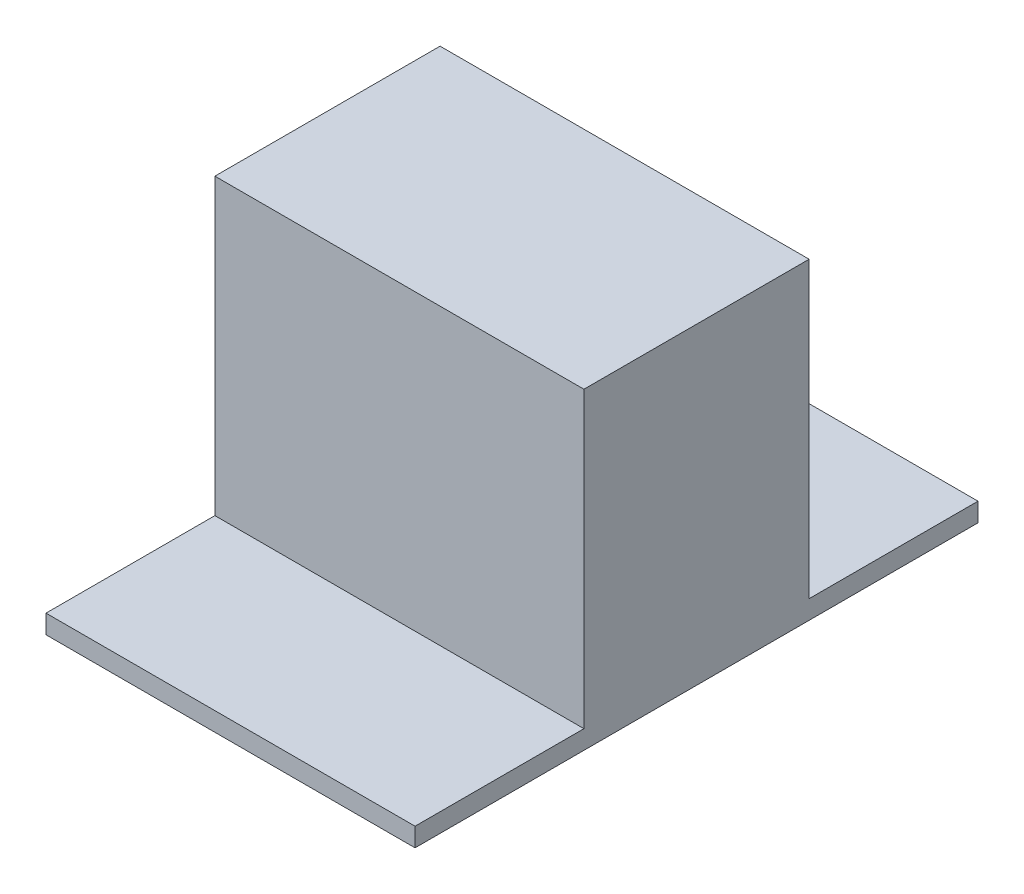
ISO-10303-21;
HEADER;
FILE_DESCRIPTION(('STEP AP214'),'2;1');
FILE_NAME('part.step','',(''),(''),'','','');
FILE_SCHEMA(('AUTOMOTIVE_DESIGN { 1 0 10303 214 1 1 1 1 }'));
ENDSEC;
DATA;
#1=APPLICATION_CONTEXT('core data for automotive mechanical design processes');
#2=APPLICATION_PROTOCOL_DEFINITION('international standard','automotive_design',2000,#1);
#3=PRODUCT_CONTEXT('',#1,'mechanical');
#4=PRODUCT('Part','Part','',(#3));
#5=PRODUCT_RELATED_PRODUCT_CATEGORY('part','',(#4));
#6=PRODUCT_DEFINITION_FORMATION('','',#4);
#7=PRODUCT_DEFINITION_CONTEXT('part definition',#1,'design');
#8=PRODUCT_DEFINITION('design','',#6,#7);
#9=PRODUCT_DEFINITION_SHAPE('','',#8);
#10=(LENGTH_UNIT() NAMED_UNIT(*) SI_UNIT(.MILLI.,.METRE.));
#11=(NAMED_UNIT(*) PLANE_ANGLE_UNIT() SI_UNIT($,.RADIAN.));
#12=(NAMED_UNIT(*) SI_UNIT($,.STERADIAN.) SOLID_ANGLE_UNIT());
#13=UNCERTAINTY_MEASURE_WITH_UNIT(LENGTH_MEASURE(1.E-05),#10,'distance_accuracy_value','');
#14=(GEOMETRIC_REPRESENTATION_CONTEXT(3) GLOBAL_UNCERTAINTY_ASSIGNED_CONTEXT((#13)) GLOBAL_UNIT_ASSIGNED_CONTEXT((#10,
#11,#12)) REPRESENTATION_CONTEXT('',''));
#15=CARTESIAN_POINT('',(0.,0.,0.));
#16=DIRECTION('',(0.,0.,1.));
#17=DIRECTION('',(1.,0.,0.));
#18=AXIS2_PLACEMENT_3D('',#15,#16,#17);
#19=CARTESIAN_POINT('',(0.,0.,0.));
#20=DIRECTION('',(0.,0.,-1.));
#21=DIRECTION('',(-1.,0.,0.));
#22=AXIS2_PLACEMENT_3D('',#19,#20,#21);
#23=PLANE('',#22);
#24=DIRECTION('',(0.,1.,0.));
#25=VECTOR('',#24,1.);
#26=CARTESIAN_POINT('',(590.,0.,0.));
#27=LINE('',#26,#25);
#28=CARTESIAN_POINT('',(590.,30.,0.));
#29=VERTEX_POINT('',#28);
#30=CARTESIAN_POINT('',(590.,500.,0.));
#31=VERTEX_POINT('',#30);
#32=EDGE_CURVE('E232',#29,#31,#27,.T.);
#33=ORIENTED_EDGE('',*,*,#32,.F.);
#34=DIRECTION('',(-1.,0.,0.));
#35=VECTOR('',#34,1.);
#36=CARTESIAN_POINT('',(590.,30.,0.));
#37=LINE('',#36,#35);
#38=CARTESIAN_POINT('',(0.,29.9999999999999,0.));
#39=VERTEX_POINT('',#38);
#40=EDGE_CURVE('E127',#29,#39,#37,.T.);
#41=ORIENTED_EDGE('',*,*,#40,.T.);
#42=DIRECTION('',(0.,-1.,0.));
#43=VECTOR('',#42,1.);
#44=CARTESIAN_POINT('',(0.,0.,0.));
#45=LINE('',#44,#43);
#46=CARTESIAN_POINT('',(0.,500.,0.));
#47=VERTEX_POINT('',#46);
#48=EDGE_CURVE('E221',#47,#39,#45,.T.);
#49=ORIENTED_EDGE('',*,*,#48,.F.);
#50=DIRECTION('',(-1.,0.,0.));
#51=VECTOR('',#50,1.);
#52=CARTESIAN_POINT('',(0.,500.,0.));
#53=LINE('',#52,#51);
#54=EDGE_CURVE('E225',#31,#47,#53,.T.);
#55=ORIENTED_EDGE('',*,*,#54,.F.);
#56=EDGE_LOOP('',(#33,#41,#49,#55));
#57=FACE_BOUND('',#56,.T.);
#58=ADVANCED_FACE('F32',(#57),#23,.T.);
#59=DIRECTION('',(0.,1.,0.));
#60=VECTOR('',#59,1.);
#61=CARTESIAN_POINT('',(30.0000000000001,-10.,0.));
#62=LINE('',#61,#60);
#63=CARTESIAN_POINT('',(30.0000000000001,-10.,0.));
#64=VERTEX_POINT('',#63);
#65=CARTESIAN_POINT('',(30.0000000000001,0.,0.));
#66=VERTEX_POINT('',#65);
#67=EDGE_CURVE('E214',#64,#66,#62,.T.);
#68=ORIENTED_EDGE('',*,*,#67,.T.);
#69=DIRECTION('',(1.,0.,0.));
#70=VECTOR('',#69,1.);
#71=CARTESIAN_POINT('',(590.,0.,0.));
#72=LINE('',#71,#70);
#73=CARTESIAN_POINT('',(560.,0.,0.));
#74=VERTEX_POINT('',#73);
#75=EDGE_CURVE('E11',#66,#74,#72,.T.);
#76=ORIENTED_EDGE('',*,*,#75,.T.);
#77=DIRECTION('',(0.,1.,0.));
#78=VECTOR('',#77,1.);
#79=CARTESIAN_POINT('',(560.,-10.,0.));
#80=LINE('',#79,#78);
#81=CARTESIAN_POINT('',(560.,-10.,0.));
#82=VERTEX_POINT('',#81);
#83=EDGE_CURVE('E208',#82,#74,#80,.T.);
#84=ORIENTED_EDGE('',*,*,#83,.F.);
#85=DIRECTION('',(1.,0.,0.));
#86=VECTOR('',#85,1.);
#87=CARTESIAN_POINT('',(30.0000000000001,-10.,0.));
#88=LINE('',#87,#86);
#89=EDGE_CURVE('E206',#64,#82,#88,.T.);
#90=ORIENTED_EDGE('',*,*,#89,.F.);
#91=EDGE_LOOP('',(#68,#76,#84,#90));
#92=FACE_BOUND('',#91,.T.);
#93=ADVANCED_FACE('F270',(#92),#23,.T.);
#94=CARTESIAN_POINT('',(0.,0.,360.));
#95=DIRECTION('',(0.,0.,-1.));
#96=DIRECTION('',(-1.,0.,0.));
#97=AXIS2_PLACEMENT_3D('',#94,#95,#96);
#98=PLANE('',#97);
#99=DIRECTION('',(1.,0.,0.));
#100=VECTOR('',#99,1.);
#101=CARTESIAN_POINT('',(590.,0.,360.));
#102=LINE('',#101,#100);
#103=CARTESIAN_POINT('',(30.0000000000001,0.,360.));
#104=VERTEX_POINT('',#103);
#105=CARTESIAN_POINT('',(560.,0.,360.));
#106=VERTEX_POINT('',#105);
#107=EDGE_CURVE('E41',#104,#106,#102,.T.);
#108=ORIENTED_EDGE('',*,*,#107,.F.);
#109=DIRECTION('',(0.,1.,0.));
#110=VECTOR('',#109,1.);
#111=CARTESIAN_POINT('',(30.0000000000001,-10.,360.));
#112=LINE('',#111,#110);
#113=CARTESIAN_POINT('',(30.0000000000001,-10.,360.));
#114=VERTEX_POINT('',#113);
#115=EDGE_CURVE('E217',#114,#104,#112,.T.);
#116=ORIENTED_EDGE('',*,*,#115,.F.);
#117=DIRECTION('',(-1.,0.,0.));
#118=VECTOR('',#117,1.);
#119=CARTESIAN_POINT('',(30.0000000000001,-10.,360.));
#120=LINE('',#119,#118);
#121=CARTESIAN_POINT('',(560.,-10.,360.));
#122=VERTEX_POINT('',#121);
#123=EDGE_CURVE('E201',#122,#114,#120,.T.);
#124=ORIENTED_EDGE('',*,*,#123,.F.);
#125=DIRECTION('',(0.,1.,0.));
#126=VECTOR('',#125,1.);
#127=CARTESIAN_POINT('',(560.,-10.,360.));
#128=LINE('',#127,#126);
#129=EDGE_CURVE('E57',#122,#106,#128,.T.);
#130=ORIENTED_EDGE('',*,*,#129,.T.);
#131=EDGE_LOOP('',(#108,#116,#124,#130));
#132=FACE_BOUND('',#131,.T.);
#133=ADVANCED_FACE('F275',(#132),#98,.F.);
#134=DIRECTION('',(-1.,0.,0.));
#135=VECTOR('',#134,1.);
#136=CARTESIAN_POINT('',(590.,30.,360.));
#137=LINE('',#136,#135);
#138=CARTESIAN_POINT('',(590.,30.,360.));
#139=VERTEX_POINT('',#138);
#140=CARTESIAN_POINT('',(0.,29.9999999999999,360.));
#141=VERTEX_POINT('',#140);
#142=EDGE_CURVE('E49',#139,#141,#137,.T.);
#143=ORIENTED_EDGE('',*,*,#142,.F.);
#144=DIRECTION('',(0.,1.,0.));
#145=VECTOR('',#144,1.);
#146=CARTESIAN_POINT('',(590.,0.,360.));
#147=LINE('',#146,#145);
#148=CARTESIAN_POINT('',(590.,500.,360.));
#149=VERTEX_POINT('',#148);
#150=EDGE_CURVE('E224',#139,#149,#147,.T.);
#151=ORIENTED_EDGE('',*,*,#150,.T.);
#152=DIRECTION('',(-1.,0.,0.));
#153=VECTOR('',#152,1.);
#154=CARTESIAN_POINT('',(0.,500.,360.));
#155=LINE('',#154,#153);
#156=CARTESIAN_POINT('',(0.,500.,360.));
#157=VERTEX_POINT('',#156);
#158=EDGE_CURVE('E227',#149,#157,#155,.T.);
#159=ORIENTED_EDGE('',*,*,#158,.T.);
#160=DIRECTION('',(0.,-1.,0.));
#161=VECTOR('',#160,1.);
#162=CARTESIAN_POINT('',(0.,0.,360.));
#163=LINE('',#162,#161);
#164=EDGE_CURVE('E222',#157,#141,#163,.T.);
#165=ORIENTED_EDGE('',*,*,#164,.T.);
#166=EDGE_LOOP('',(#143,#151,#159,#165));
#167=FACE_BOUND('',#166,.T.);
#168=ADVANCED_FACE('F253',(#167),#98,.F.);
#169=CARTESIAN_POINT('',(0.,0.,360.));
#170=DIRECTION('',(0.,1.,0.));
#171=DIRECTION('',(0.,0.,1.));
#172=AXIS2_PLACEMENT_3D('',#169,#170,#171);
#173=PLANE('',#172);
#174=ORIENTED_EDGE('',*,*,#75,.F.);
#175=DIRECTION('',(0.,0.,-1.));
#176=VECTOR('',#175,1.);
#177=CARTESIAN_POINT('',(30.0000000000001,0.,0.));
#178=LINE('',#177,#176);
#179=EDGE_CURVE('E202',#104,#66,#178,.T.);
#180=ORIENTED_EDGE('',*,*,#179,.F.);
#181=ORIENTED_EDGE('',*,*,#107,.T.);
#182=DIRECTION('',(0.,0.,1.));
#183=VECTOR('',#182,1.);
#184=CARTESIAN_POINT('',(560.,0.,0.));
#185=LINE('',#184,#183);
#186=EDGE_CURVE('E195',#74,#106,#185,.T.);
#187=ORIENTED_EDGE('',*,*,#186,.F.);
#188=EDGE_LOOP('',(#174,#180,#181,#187));
#189=FACE_BOUND('',#188,.T.);
#190=DIRECTION('',(0.,0.,-1.));
#191=VECTOR('',#190,1.);
#192=CARTESIAN_POINT('',(0.,0.,360.));
#193=LINE('',#192,#191);
#194=CARTESIAN_POINT('',(0.,0.,630.));
#195=VERTEX_POINT('',#194);
#196=CARTESIAN_POINT('',(0.,0.,-270.));
#197=VERTEX_POINT('',#196);
#198=EDGE_CURVE('E36',#195,#197,#193,.T.);
#199=ORIENTED_EDGE('',*,*,#198,.T.);
#200=DIRECTION('',(1.,0.,0.));
#201=VECTOR('',#200,1.);
#202=CARTESIAN_POINT('',(590.,0.,-270.));
#203=LINE('',#202,#201);
#204=CARTESIAN_POINT('',(590.,0.,-270.));
#205=VERTEX_POINT('',#204);
#206=EDGE_CURVE('E132',#197,#205,#203,.T.);
#207=ORIENTED_EDGE('',*,*,#206,.T.);
#208=DIRECTION('',(0.,0.,-1.));
#209=VECTOR('',#208,1.);
#210=CARTESIAN_POINT('',(590.,0.,360.));
#211=LINE('',#210,#209);
#212=CARTESIAN_POINT('',(590.,0.,630.));
#213=VERTEX_POINT('',#212);
#214=EDGE_CURVE('E146',#213,#205,#211,.T.);
#215=ORIENTED_EDGE('',*,*,#214,.F.);
#216=DIRECTION('',(1.,0.,0.));
#217=VECTOR('',#216,1.);
#218=CARTESIAN_POINT('',(590.,0.,630.));
#219=LINE('',#218,#217);
#220=EDGE_CURVE('E161',#195,#213,#219,.T.);
#221=ORIENTED_EDGE('',*,*,#220,.F.);
#222=EDGE_LOOP('',(#199,#207,#215,#221));
#223=FACE_BOUND('',#222,.T.);
#224=ADVANCED_FACE('F241',(#189,#223),#173,.F.);
#225=CARTESIAN_POINT('',(0.,0.,360.));
#226=DIRECTION('',(1.,0.,0.));
#227=DIRECTION('',(0.,0.,-1.));
#228=AXIS2_PLACEMENT_3D('',#225,#226,#227);
#229=PLANE('',#228);
#230=ORIENTED_EDGE('',*,*,#48,.T.);
#231=DIRECTION('',(0.,0.,1.));
#232=VECTOR('',#231,1.);
#233=CARTESIAN_POINT('',(0.,29.9999999999999,-270.));
#234=LINE('',#233,#232);
#235=CARTESIAN_POINT('',(0.,29.9999999999999,-270.));
#236=VERTEX_POINT('',#235);
#237=EDGE_CURVE('E131',#236,#39,#234,.T.);
#238=ORIENTED_EDGE('',*,*,#237,.F.);
#239=DIRECTION('',(0.,-1.,0.));
#240=VECTOR('',#239,1.);
#241=CARTESIAN_POINT('',(0.,0.,-270.));
#242=LINE('',#241,#240);
#243=EDGE_CURVE('E142',#236,#197,#242,.T.);
#244=ORIENTED_EDGE('',*,*,#243,.T.);
#245=ORIENTED_EDGE('',*,*,#198,.F.);
#246=DIRECTION('',(0.,-1.,0.));
#247=VECTOR('',#246,1.);
#248=CARTESIAN_POINT('',(0.,0.,630.));
#249=LINE('',#248,#247);
#250=CARTESIAN_POINT('',(0.,29.9999999999999,630.));
#251=VERTEX_POINT('',#250);
#252=EDGE_CURVE('E158',#251,#195,#249,.T.);
#253=ORIENTED_EDGE('',*,*,#252,.F.);
#254=DIRECTION('',(0.,0.,-1.));
#255=VECTOR('',#254,1.);
#256=CARTESIAN_POINT('',(0.,29.9999999999999,630.));
#257=LINE('',#256,#255);
#258=EDGE_CURVE('E164',#251,#141,#257,.T.);
#259=ORIENTED_EDGE('',*,*,#258,.T.);
#260=ORIENTED_EDGE('',*,*,#164,.F.);
#261=DIRECTION('',(0.,0.,-1.));
#262=VECTOR('',#261,1.);
#263=CARTESIAN_POINT('',(0.,500.,360.));
#264=LINE('',#263,#262);
#265=EDGE_CURVE('E229',#157,#47,#264,.T.);
#266=ORIENTED_EDGE('',*,*,#265,.T.);
#267=EDGE_LOOP('',(#230,#238,#244,#245,#253,#259,#260,#266));
#268=FACE_BOUND('',#267,.T.);
#269=ADVANCED_FACE('F34',(#268),#229,.F.);
#270=CARTESIAN_POINT('',(590.,0.,360.));
#271=DIRECTION('',(-1.,0.,0.));
#272=DIRECTION('',(0.,0.,1.));
#273=AXIS2_PLACEMENT_3D('',#270,#271,#272);
#274=PLANE('',#273);
#275=ORIENTED_EDGE('',*,*,#214,.T.);
#276=DIRECTION('',(0.,1.,0.));
#277=VECTOR('',#276,1.);
#278=CARTESIAN_POINT('',(590.,0.,-270.));
#279=LINE('',#278,#277);
#280=CARTESIAN_POINT('',(590.,30.,-270.));
#281=VERTEX_POINT('',#280);
#282=EDGE_CURVE('E139',#205,#281,#279,.T.);
#283=ORIENTED_EDGE('',*,*,#282,.T.);
#284=DIRECTION('',(0.,0.,1.));
#285=VECTOR('',#284,1.);
#286=CARTESIAN_POINT('',(590.,30.,-270.));
#287=LINE('',#286,#285);
#288=EDGE_CURVE('E122',#281,#29,#287,.T.);
#289=ORIENTED_EDGE('',*,*,#288,.T.);
#290=ORIENTED_EDGE('',*,*,#32,.T.);
#291=DIRECTION('',(0.,0.,-1.));
#292=VECTOR('',#291,1.);
#293=CARTESIAN_POINT('',(590.,500.,360.));
#294=LINE('',#293,#292);
#295=EDGE_CURVE('E237',#149,#31,#294,.T.);
#296=ORIENTED_EDGE('',*,*,#295,.F.);
#297=ORIENTED_EDGE('',*,*,#150,.F.);
#298=DIRECTION('',(0.,0.,-1.));
#299=VECTOR('',#298,1.);
#300=CARTESIAN_POINT('',(590.,30.,630.));
#301=LINE('',#300,#299);
#302=CARTESIAN_POINT('',(590.,30.,630.));
#303=VERTEX_POINT('',#302);
#304=EDGE_CURVE('E170',#303,#139,#301,.T.);
#305=ORIENTED_EDGE('',*,*,#304,.F.);
#306=DIRECTION('',(0.,1.,0.));
#307=VECTOR('',#306,1.);
#308=CARTESIAN_POINT('',(590.,0.,630.));
#309=LINE('',#308,#307);
#310=EDGE_CURVE('E153',#213,#303,#309,.T.);
#311=ORIENTED_EDGE('',*,*,#310,.F.);
#312=EDGE_LOOP('',(#275,#283,#289,#290,#296,#297,#305,#311));
#313=FACE_BOUND('',#312,.T.);
#314=ADVANCED_FACE('F144',(#313),#274,.F.);
#315=CARTESIAN_POINT('',(0.,500.,360.));
#316=DIRECTION('',(0.,-1.,0.));
#317=DIRECTION('',(0.,0.,-1.));
#318=AXIS2_PLACEMENT_3D('',#315,#316,#317);
#319=PLANE('',#318);
#320=ORIENTED_EDGE('',*,*,#54,.T.);
#321=ORIENTED_EDGE('',*,*,#265,.F.);
#322=ORIENTED_EDGE('',*,*,#158,.F.);
#323=ORIENTED_EDGE('',*,*,#295,.T.);
#324=EDGE_LOOP('',(#320,#321,#322,#323));
#325=FACE_BOUND('',#324,.T.);
#326=ADVANCED_FACE('F250',(#325),#319,.F.);
#327=CARTESIAN_POINT('',(560.,-10.,0.));
#328=DIRECTION('',(-1.,0.,0.));
#329=DIRECTION('',(0.,0.,1.));
#330=AXIS2_PLACEMENT_3D('',#327,#328,#329);
#331=PLANE('',#330);
#332=ORIENTED_EDGE('',*,*,#186,.T.);
#333=ORIENTED_EDGE('',*,*,#129,.F.);
#334=DIRECTION('',(0.,0.,1.));
#335=VECTOR('',#334,1.);
#336=CARTESIAN_POINT('',(560.,-10.,0.));
#337=LINE('',#336,#335);
#338=EDGE_CURVE('E198',#82,#122,#337,.T.);
#339=ORIENTED_EDGE('',*,*,#338,.F.);
#340=ORIENTED_EDGE('',*,*,#83,.T.);
#341=EDGE_LOOP('',(#332,#333,#339,#340));
#342=FACE_BOUND('',#341,.T.);
#343=ADVANCED_FACE('F282',(#342),#331,.F.);
#344=CARTESIAN_POINT('',(30.0000000000001,-10.,0.));
#345=DIRECTION('',(1.,0.,0.));
#346=DIRECTION('',(0.,0.,-1.));
#347=AXIS2_PLACEMENT_3D('',#344,#345,#346);
#348=PLANE('',#347);
#349=ORIENTED_EDGE('',*,*,#179,.T.);
#350=ORIENTED_EDGE('',*,*,#67,.F.);
#351=DIRECTION('',(0.,0.,-1.));
#352=VECTOR('',#351,1.);
#353=CARTESIAN_POINT('',(30.0000000000001,-10.,0.));
#354=LINE('',#353,#352);
#355=EDGE_CURVE('E204',#114,#64,#354,.T.);
#356=ORIENTED_EDGE('',*,*,#355,.F.);
#357=ORIENTED_EDGE('',*,*,#115,.T.);
#358=EDGE_LOOP('',(#349,#350,#356,#357));
#359=FACE_BOUND('',#358,.T.);
#360=ADVANCED_FACE('F295',(#359),#348,.F.);
#361=CARTESIAN_POINT('',(0.,-10.,0.));
#362=DIRECTION('',(0.,1.,0.));
#363=DIRECTION('',(0.,0.,1.));
#364=AXIS2_PLACEMENT_3D('',#361,#362,#363);
#365=PLANE('',#364);
#366=CARTESIAN_POINT('',(75.0000000000001,-10.,12.5));
#367=DIRECTION('',(0.,-1.,0.));
#368=DIRECTION('',(0.,0.,-1.));
#369=AXIS2_PLACEMENT_3D('',#366,#367,#368);
#370=CIRCLE('',#369,3.99999999999999);
#371=CARTESIAN_POINT('',(75.0000000000001,-10.,8.49999999999996));
#372=VERTEX_POINT('',#371);
#373=EDGE_CURVE('E178',#372,#372,#370,.T.);
#374=ORIENTED_EDGE('',*,*,#373,.F.);
#375=EDGE_LOOP('',(#374));
#376=FACE_BOUND('',#375,.T.);
#377=CARTESIAN_POINT('',(515.,-10.,347.5));
#378=DIRECTION('',(0.,-1.,0.));
#379=DIRECTION('',(0.,0.,-1.));
#380=AXIS2_PLACEMENT_3D('',#377,#378,#379);
#381=CIRCLE('',#380,3.99999999999999);
#382=CARTESIAN_POINT('',(515.,-10.,343.5));
#383=VERTEX_POINT('',#382);
#384=EDGE_CURVE('E184',#383,#383,#381,.T.);
#385=ORIENTED_EDGE('',*,*,#384,.F.);
#386=EDGE_LOOP('',(#385));
#387=FACE_BOUND('',#386,.T.);
#388=CARTESIAN_POINT('',(75.0000000000001,-10.,347.5));
#389=DIRECTION('',(0.,-1.,0.));
#390=DIRECTION('',(0.,0.,-1.));
#391=AXIS2_PLACEMENT_3D('',#388,#389,#390);
#392=CIRCLE('',#391,3.99999999999999);
#393=CARTESIAN_POINT('',(75.0000000000001,-10.,343.5));
#394=VERTEX_POINT('',#393);
#395=EDGE_CURVE('E173',#394,#394,#392,.T.);
#396=ORIENTED_EDGE('',*,*,#395,.F.);
#397=EDGE_LOOP('',(#396));
#398=FACE_BOUND('',#397,.T.);
#399=CARTESIAN_POINT('',(515.,-10.,12.5));
#400=DIRECTION('',(0.,-1.,0.));
#401=DIRECTION('',(0.,0.,-1.));
#402=AXIS2_PLACEMENT_3D('',#399,#400,#401);
#403=CIRCLE('',#402,3.99999999999999);
#404=CARTESIAN_POINT('',(515.,-10.,8.49999999999996));
#405=VERTEX_POINT('',#404);
#406=EDGE_CURVE('E177',#405,#405,#403,.T.);
#407=ORIENTED_EDGE('',*,*,#406,.F.);
#408=EDGE_LOOP('',(#407));
#409=FACE_BOUND('',#408,.T.);
#410=ORIENTED_EDGE('',*,*,#338,.T.);
#411=ORIENTED_EDGE('',*,*,#123,.T.);
#412=ORIENTED_EDGE('',*,*,#355,.T.);
#413=ORIENTED_EDGE('',*,*,#89,.T.);
#414=EDGE_LOOP('',(#410,#411,#412,#413));
#415=FACE_BOUND('',#414,.T.);
#416=ADVANCED_FACE('F301',(#376,#387,#398,#409,#415),#365,.F.);
#417=CARTESIAN_POINT('',(515.,0.,12.5));
#418=DIRECTION('',(0.,-1.,0.));
#419=DIRECTION('',(0.,0.,-1.));
#420=AXIS2_PLACEMENT_3D('',#417,#418,#419);
#421=CYLINDRICAL_SURFACE('',#420,3.99999999999999);
#422=CARTESIAN_POINT('',(515.,0.,12.5));
#423=DIRECTION('',(0.,-1.,0.));
#424=DIRECTION('',(0.,0.,-1.));
#425=AXIS2_PLACEMENT_3D('',#422,#423,#424);
#426=CIRCLE('',#425,3.99999999999999);
#427=CARTESIAN_POINT('',(515.,0.,8.49999999999996));
#428=VERTEX_POINT('',#427);
#429=EDGE_CURVE('E192',#428,#428,#426,.T.);
#430=ORIENTED_EDGE('',*,*,#429,.F.);
#431=EDGE_LOOP('',(#430));
#432=FACE_BOUND('',#431,.T.);
#433=ORIENTED_EDGE('',*,*,#406,.T.);
#434=EDGE_LOOP('',(#433));
#435=FACE_BOUND('',#434,.T.);
#436=ADVANCED_FACE('F394',(#432,#435),#421,.F.);
#437=CARTESIAN_POINT('',(515.,0.,12.5));
#438=DIRECTION('',(0.,-1.,0.));
#439=DIRECTION('',(0.,0.,-1.));
#440=AXIS2_PLACEMENT_3D('',#437,#438,#439);
#441=PLANE('',#440);
#442=ORIENTED_EDGE('',*,*,#429,.T.);
#443=EDGE_LOOP('',(#442));
#444=FACE_BOUND('',#443,.T.);
#445=ADVANCED_FACE('F402',(#444),#441,.T.);
#446=CARTESIAN_POINT('',(75.0000000000001,0.,347.5));
#447=DIRECTION('',(0.,-1.,0.));
#448=DIRECTION('',(0.,0.,-1.));
#449=AXIS2_PLACEMENT_3D('',#446,#447,#448);
#450=CYLINDRICAL_SURFACE('',#449,3.99999999999999);
#451=CARTESIAN_POINT('',(75.0000000000001,0.,347.5));
#452=DIRECTION('',(0.,-1.,0.));
#453=DIRECTION('',(0.,0.,-1.));
#454=AXIS2_PLACEMENT_3D('',#451,#452,#453);
#455=CIRCLE('',#454,3.99999999999999);
#456=CARTESIAN_POINT('',(75.0000000000001,0.,343.5));
#457=VERTEX_POINT('',#456);
#458=EDGE_CURVE('E187',#457,#457,#455,.T.);
#459=ORIENTED_EDGE('',*,*,#458,.F.);
#460=EDGE_LOOP('',(#459));
#461=FACE_BOUND('',#460,.T.);
#462=ORIENTED_EDGE('',*,*,#395,.T.);
#463=EDGE_LOOP('',(#462));
#464=FACE_BOUND('',#463,.T.);
#465=ADVANCED_FACE('F410',(#461,#464),#450,.F.);
#466=CARTESIAN_POINT('',(75.0000000000001,0.,347.5));
#467=DIRECTION('',(0.,-1.,0.));
#468=DIRECTION('',(0.,0.,-1.));
#469=AXIS2_PLACEMENT_3D('',#466,#467,#468);
#470=PLANE('',#469);
#471=ORIENTED_EDGE('',*,*,#458,.T.);
#472=EDGE_LOOP('',(#471));
#473=FACE_BOUND('',#472,.T.);
#474=ADVANCED_FACE('F418',(#473),#470,.T.);
#475=CARTESIAN_POINT('',(515.,0.,347.5));
#476=DIRECTION('',(0.,-1.,0.));
#477=DIRECTION('',(0.,0.,-1.));
#478=AXIS2_PLACEMENT_3D('',#475,#476,#477);
#479=CYLINDRICAL_SURFACE('',#478,3.99999999999999);
#480=CARTESIAN_POINT('',(515.,0.,347.5));
#481=DIRECTION('',(0.,-1.,0.));
#482=DIRECTION('',(0.,0.,-1.));
#483=AXIS2_PLACEMENT_3D('',#480,#481,#482);
#484=CIRCLE('',#483,3.99999999999999);
#485=CARTESIAN_POINT('',(515.,0.,343.5));
#486=VERTEX_POINT('',#485);
#487=EDGE_CURVE('E181',#486,#486,#484,.T.);
#488=ORIENTED_EDGE('',*,*,#487,.F.);
#489=EDGE_LOOP('',(#488));
#490=FACE_BOUND('',#489,.T.);
#491=ORIENTED_EDGE('',*,*,#384,.T.);
#492=EDGE_LOOP('',(#491));
#493=FACE_BOUND('',#492,.T.);
#494=ADVANCED_FACE('F426',(#490,#493),#479,.F.);
#495=CARTESIAN_POINT('',(515.,0.,347.5));
#496=DIRECTION('',(0.,-1.,0.));
#497=DIRECTION('',(0.,0.,-1.));
#498=AXIS2_PLACEMENT_3D('',#495,#496,#497);
#499=PLANE('',#498);
#500=ORIENTED_EDGE('',*,*,#487,.T.);
#501=EDGE_LOOP('',(#500));
#502=FACE_BOUND('',#501,.T.);
#503=ADVANCED_FACE('F434',(#502),#499,.T.);
#504=CARTESIAN_POINT('',(75.0000000000001,0.,12.5));
#505=DIRECTION('',(0.,-1.,0.));
#506=DIRECTION('',(0.,0.,-1.));
#507=AXIS2_PLACEMENT_3D('',#504,#505,#506);
#508=CYLINDRICAL_SURFACE('',#507,3.99999999999999);
#509=CARTESIAN_POINT('',(75.0000000000001,0.,12.5));
#510=DIRECTION('',(0.,-1.,0.));
#511=DIRECTION('',(0.,0.,-1.));
#512=AXIS2_PLACEMENT_3D('',#509,#510,#511);
#513=CIRCLE('',#512,3.99999999999999);
#514=CARTESIAN_POINT('',(75.0000000000001,0.,8.49999999999996));
#515=VERTEX_POINT('',#514);
#516=EDGE_CURVE('E174',#515,#515,#513,.T.);
#517=ORIENTED_EDGE('',*,*,#516,.F.);
#518=EDGE_LOOP('',(#517));
#519=FACE_BOUND('',#518,.T.);
#520=ORIENTED_EDGE('',*,*,#373,.T.);
#521=EDGE_LOOP('',(#520));
#522=FACE_BOUND('',#521,.T.);
#523=ADVANCED_FACE('F442',(#519,#522),#508,.F.);
#524=CARTESIAN_POINT('',(75.0000000000001,0.,12.5));
#525=DIRECTION('',(0.,-1.,0.));
#526=DIRECTION('',(0.,0.,-1.));
#527=AXIS2_PLACEMENT_3D('',#524,#525,#526);
#528=PLANE('',#527);
#529=ORIENTED_EDGE('',*,*,#516,.T.);
#530=EDGE_LOOP('',(#529));
#531=FACE_BOUND('',#530,.T.);
#532=ADVANCED_FACE('F267',(#531),#528,.T.);
#533=CARTESIAN_POINT('',(590.,30.,630.));
#534=DIRECTION('',(0.,-1.,0.));
#535=DIRECTION('',(1.,0.,0.));
#536=AXIS2_PLACEMENT_3D('',#533,#534,#535);
#537=PLANE('',#536);
#538=ORIENTED_EDGE('',*,*,#142,.T.);
#539=ORIENTED_EDGE('',*,*,#258,.F.);
#540=DIRECTION('',(-1.,0.,0.));
#541=VECTOR('',#540,1.);
#542=CARTESIAN_POINT('',(590.,30.,630.));
#543=LINE('',#542,#541);
#544=EDGE_CURVE('E156',#303,#251,#543,.T.);
#545=ORIENTED_EDGE('',*,*,#544,.F.);
#546=ORIENTED_EDGE('',*,*,#304,.T.);
#547=EDGE_LOOP('',(#538,#539,#545,#546));
#548=FACE_BOUND('',#547,.T.);
#549=ADVANCED_FACE('F256',(#548),#537,.F.);
#550=CARTESIAN_POINT('',(0.,0.,630.));
#551=DIRECTION('',(0.,0.,1.));
#552=DIRECTION('',(1.,0.,0.));
#553=AXIS2_PLACEMENT_3D('',#550,#551,#552);
#554=PLANE('',#553);
#555=ORIENTED_EDGE('',*,*,#310,.T.);
#556=ORIENTED_EDGE('',*,*,#544,.T.);
#557=ORIENTED_EDGE('',*,*,#252,.T.);
#558=ORIENTED_EDGE('',*,*,#220,.T.);
#559=EDGE_LOOP('',(#555,#556,#557,#558));
#560=FACE_BOUND('',#559,.T.);
#561=ADVANCED_FACE('F259',(#560),#554,.T.);
#562=CARTESIAN_POINT('',(590.,30.,-270.));
#563=DIRECTION('',(0.,1.,0.));
#564=DIRECTION('',(-1.,0.,0.));
#565=AXIS2_PLACEMENT_3D('',#562,#563,#564);
#566=PLANE('',#565);
#567=ORIENTED_EDGE('',*,*,#40,.F.);
#568=ORIENTED_EDGE('',*,*,#288,.F.);
#569=DIRECTION('',(-1.,0.,0.));
#570=VECTOR('',#569,1.);
#571=CARTESIAN_POINT('',(590.,30.,-270.));
#572=LINE('',#571,#570);
#573=EDGE_CURVE('E125',#281,#236,#572,.T.);
#574=ORIENTED_EDGE('',*,*,#573,.T.);
#575=ORIENTED_EDGE('',*,*,#237,.T.);
#576=EDGE_LOOP('',(#567,#568,#574,#575));
#577=FACE_BOUND('',#576,.T.);
#578=ADVANCED_FACE('F124',(#577),#566,.T.);
#579=CARTESIAN_POINT('',(0.,0.,-270.));
#580=DIRECTION('',(0.,0.,1.));
#581=DIRECTION('',(1.,0.,0.));
#582=AXIS2_PLACEMENT_3D('',#579,#580,#581);
#583=PLANE('',#582);
#584=ORIENTED_EDGE('',*,*,#282,.F.);
#585=ORIENTED_EDGE('',*,*,#206,.F.);
#586=ORIENTED_EDGE('',*,*,#243,.F.);
#587=ORIENTED_EDGE('',*,*,#573,.F.);
#588=EDGE_LOOP('',(#584,#585,#586,#587));
#589=FACE_BOUND('',#588,.T.);
#590=ADVANCED_FACE('F137',(#589),#583,.F.);
#591=CLOSED_SHELL('',(#58,#93,#133,#168,#224,#269,#314,#326,#343,#360,#416,#436,#445,#465,#474,
#494,#503,#523,#532,#549,#561,#578,#590));
#592=MANIFOLD_SOLID_BREP('B2',#591);
#593=ADVANCED_BREP_SHAPE_REPRESENTATION('',(#18,#592),#14);
#594=SHAPE_DEFINITION_REPRESENTATION(#9,#593);
ENDSEC;
END-ISO-10303-21;
